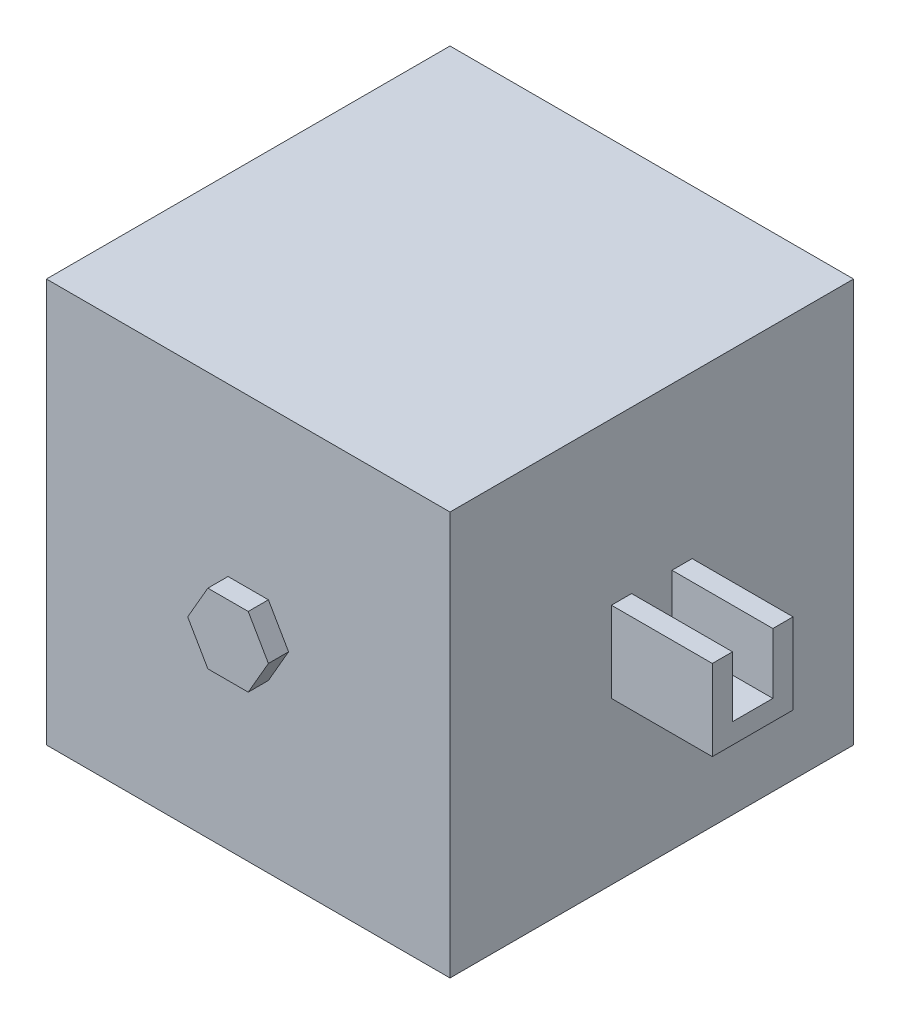
ISO-10303-21;
HEADER;
FILE_DESCRIPTION(('STEP AP214'),'2;1');
FILE_NAME('part.step','',(''),(''),'','','');
FILE_SCHEMA(('AUTOMOTIVE_DESIGN { 1 0 10303 214 1 1 1 1 }'));
ENDSEC;
DATA;
#1=APPLICATION_CONTEXT('core data for automotive mechanical design processes');
#2=APPLICATION_PROTOCOL_DEFINITION('international standard','automotive_design',2000,#1);
#3=PRODUCT_CONTEXT('',#1,'mechanical');
#4=PRODUCT('Part','Part','',(#3));
#5=PRODUCT_RELATED_PRODUCT_CATEGORY('part','',(#4));
#6=PRODUCT_DEFINITION_FORMATION('','',#4);
#7=PRODUCT_DEFINITION_CONTEXT('part definition',#1,'design');
#8=PRODUCT_DEFINITION('design','',#6,#7);
#9=PRODUCT_DEFINITION_SHAPE('','',#8);
#10=(LENGTH_UNIT() NAMED_UNIT(*) SI_UNIT(.MILLI.,.METRE.));
#11=(NAMED_UNIT(*) PLANE_ANGLE_UNIT() SI_UNIT($,.RADIAN.));
#12=(NAMED_UNIT(*) SI_UNIT($,.STERADIAN.) SOLID_ANGLE_UNIT());
#13=UNCERTAINTY_MEASURE_WITH_UNIT(LENGTH_MEASURE(1.E-05),#10,'distance_accuracy_value','');
#14=(GEOMETRIC_REPRESENTATION_CONTEXT(3) GLOBAL_UNCERTAINTY_ASSIGNED_CONTEXT((#13)) GLOBAL_UNIT_ASSIGNED_CONTEXT((#10,
#11,#12)) REPRESENTATION_CONTEXT('',''));
#15=CARTESIAN_POINT('',(0.,0.,0.));
#16=DIRECTION('',(0.,0.,1.));
#17=DIRECTION('',(1.,0.,0.));
#18=AXIS2_PLACEMENT_3D('',#15,#16,#17);
#19=CARTESIAN_POINT('',(0.,0.,0.));
#20=DIRECTION('',(0.,0.,-1.));
#21=DIRECTION('',(-1.,0.,0.));
#22=AXIS2_PLACEMENT_3D('',#19,#20,#21);
#23=PLANE('',#22);
#24=DIRECTION('',(0.,1.,0.));
#25=VECTOR('',#24,1.);
#26=CARTESIAN_POINT('',(25.,-25.,0.));
#27=LINE('',#26,#25);
#28=CARTESIAN_POINT('',(25.,-25.,0.));
#29=VERTEX_POINT('',#28);
#30=CARTESIAN_POINT('',(25.,25.,0.));
#31=VERTEX_POINT('',#30);
#32=EDGE_CURVE('E446',#29,#31,#27,.T.);
#33=ORIENTED_EDGE('',*,*,#32,.F.);
#34=DIRECTION('',(1.,0.,0.));
#35=VECTOR('',#34,1.);
#36=CARTESIAN_POINT('',(-25.,-25.,0.));
#37=LINE('',#36,#35);
#38=CARTESIAN_POINT('',(-25.,-25.,0.));
#39=VERTEX_POINT('',#38);
#40=EDGE_CURVE('E451',#39,#29,#37,.T.);
#41=ORIENTED_EDGE('',*,*,#40,.F.);
#42=DIRECTION('',(0.,-1.,0.));
#43=VECTOR('',#42,1.);
#44=CARTESIAN_POINT('',(-25.,-25.,0.));
#45=LINE('',#44,#43);
#46=CARTESIAN_POINT('',(-25.,25.,0.));
#47=VERTEX_POINT('',#46);
#48=EDGE_CURVE('E462',#47,#39,#45,.T.);
#49=ORIENTED_EDGE('',*,*,#48,.F.);
#50=DIRECTION('',(-1.,0.,0.));
#51=VECTOR('',#50,1.);
#52=CARTESIAN_POINT('',(-25.,25.,0.));
#53=LINE('',#52,#51);
#54=EDGE_CURVE('E460',#31,#47,#53,.T.);
#55=ORIENTED_EDGE('',*,*,#54,.F.);
#56=EDGE_LOOP('',(#33,#41,#49,#55));
#57=FACE_BOUND('',#56,.T.);
#58=DIRECTION('',(0.5,0.866025403784439,0.));
#59=VECTOR('',#58,1.);
#60=CARTESIAN_POINT('',(-5.,0.,0.));
#61=LINE('',#60,#59);
#62=CARTESIAN_POINT('',(-5.,0.,0.));
#63=VERTEX_POINT('',#62);
#64=CARTESIAN_POINT('',(-2.5,4.3301270189222,0.));
#65=VERTEX_POINT('',#64);
#66=EDGE_CURVE('E965',#63,#65,#61,.T.);
#67=ORIENTED_EDGE('',*,*,#66,.F.);
#68=DIRECTION('',(-0.5,0.866025403784439,0.));
#69=VECTOR('',#68,1.);
#70=CARTESIAN_POINT('',(-2.5,-4.3301270189222,0.));
#71=LINE('',#70,#69);
#72=CARTESIAN_POINT('',(-2.5,-4.3301270189222,0.));
#73=VERTEX_POINT('',#72);
#74=EDGE_CURVE('E270',#73,#63,#71,.T.);
#75=ORIENTED_EDGE('',*,*,#74,.F.);
#76=DIRECTION('',(-1.,0.,0.));
#77=VECTOR('',#76,1.);
#78=CARTESIAN_POINT('',(2.5,-4.3301270189222,0.));
#79=LINE('',#78,#77);
#80=CARTESIAN_POINT('',(2.5,-4.3301270189222,0.));
#81=VERTEX_POINT('',#80);
#82=EDGE_CURVE('E266',#81,#73,#79,.T.);
#83=ORIENTED_EDGE('',*,*,#82,.F.);
#84=DIRECTION('',(-0.5,-0.866025403784439,0.));
#85=VECTOR('',#84,1.);
#86=CARTESIAN_POINT('',(5.,0.,0.));
#87=LINE('',#86,#85);
#88=CARTESIAN_POINT('',(5.,0.,0.));
#89=VERTEX_POINT('',#88);
#90=EDGE_CURVE('E961',#89,#81,#87,.T.);
#91=ORIENTED_EDGE('',*,*,#90,.F.);
#92=DIRECTION('',(0.5,-0.866025403784439,0.));
#93=VECTOR('',#92,1.);
#94=CARTESIAN_POINT('',(2.5,4.3301270189222,0.));
#95=LINE('',#94,#93);
#96=CARTESIAN_POINT('',(2.5,4.3301270189222,0.));
#97=VERTEX_POINT('',#96);
#98=EDGE_CURVE('E973',#97,#89,#95,.T.);
#99=ORIENTED_EDGE('',*,*,#98,.F.);
#100=DIRECTION('',(1.,0.,0.));
#101=VECTOR('',#100,1.);
#102=CARTESIAN_POINT('',(-2.5,4.3301270189222,0.));
#103=LINE('',#102,#101);
#104=EDGE_CURVE('E967',#65,#97,#103,.T.);
#105=ORIENTED_EDGE('',*,*,#104,.F.);
#106=EDGE_LOOP('',(#67,#75,#83,#91,#99,#105));
#107=FACE_BOUND('',#106,.T.);
#108=ADVANCED_FACE('F38',(#57,#107),#23,.T.);
#109=CARTESIAN_POINT('',(0.,0.,50.));
#110=DIRECTION('',(0.,0.,-1.));
#111=DIRECTION('',(-1.,0.,0.));
#112=AXIS2_PLACEMENT_3D('',#109,#110,#111);
#113=PLANE('',#112);
#114=DIRECTION('',(0.,1.,0.));
#115=VECTOR('',#114,1.);
#116=CARTESIAN_POINT('',(25.,-25.,50.));
#117=LINE('',#116,#115);
#118=CARTESIAN_POINT('',(25.,-25.,50.));
#119=VERTEX_POINT('',#118);
#120=CARTESIAN_POINT('',(25.,25.,50.));
#121=VERTEX_POINT('',#120);
#122=EDGE_CURVE('E447',#119,#121,#117,.T.);
#123=ORIENTED_EDGE('',*,*,#122,.T.);
#124=DIRECTION('',(-1.,0.,0.));
#125=VECTOR('',#124,1.);
#126=CARTESIAN_POINT('',(-25.,25.,50.));
#127=LINE('',#126,#125);
#128=CARTESIAN_POINT('',(-25.,25.,50.));
#129=VERTEX_POINT('',#128);
#130=EDGE_CURVE('E450',#121,#129,#127,.T.);
#131=ORIENTED_EDGE('',*,*,#130,.T.);
#132=DIRECTION('',(0.,-1.,0.));
#133=VECTOR('',#132,1.);
#134=CARTESIAN_POINT('',(-25.,-25.,50.));
#135=LINE('',#134,#133);
#136=CARTESIAN_POINT('',(-25.,-25.,50.));
#137=VERTEX_POINT('',#136);
#138=EDGE_CURVE('E453',#129,#137,#135,.T.);
#139=ORIENTED_EDGE('',*,*,#138,.T.);
#140=DIRECTION('',(1.,0.,0.));
#141=VECTOR('',#140,1.);
#142=CARTESIAN_POINT('',(-25.,-25.,50.));
#143=LINE('',#142,#141);
#144=EDGE_CURVE('E455',#137,#119,#143,.T.);
#145=ORIENTED_EDGE('',*,*,#144,.T.);
#146=EDGE_LOOP('',(#123,#131,#139,#145));
#147=FACE_BOUND('',#146,.T.);
#148=DIRECTION('',(0.499999999999999,0.866025403784439,0.));
#149=VECTOR('',#148,1.);
#150=CARTESIAN_POINT('',(2.5,-4.3301270189222,50.));
#151=LINE('',#150,#149);
#152=CARTESIAN_POINT('',(2.5,-4.3301270189222,50.));
#153=VERTEX_POINT('',#152);
#154=CARTESIAN_POINT('',(5.,0.,50.));
#155=VERTEX_POINT('',#154);
#156=EDGE_CURVE('E272',#153,#155,#151,.T.);
#157=ORIENTED_EDGE('',*,*,#156,.F.);
#158=DIRECTION('',(1.,0.,0.));
#159=VECTOR('',#158,1.);
#160=CARTESIAN_POINT('',(-2.5,-4.3301270189222,50.));
#161=LINE('',#160,#159);
#162=CARTESIAN_POINT('',(-2.5,-4.3301270189222,50.));
#163=VERTEX_POINT('',#162);
#164=EDGE_CURVE('E284',#163,#153,#161,.T.);
#165=ORIENTED_EDGE('',*,*,#164,.F.);
#166=DIRECTION('',(0.5,-0.866025403784438,0.));
#167=VECTOR('',#166,1.);
#168=CARTESIAN_POINT('',(-5.,0.,50.));
#169=LINE('',#168,#167);
#170=CARTESIAN_POINT('',(-5.,0.,50.));
#171=VERTEX_POINT('',#170);
#172=EDGE_CURVE('E302',#171,#163,#169,.T.);
#173=ORIENTED_EDGE('',*,*,#172,.F.);
#174=DIRECTION('',(-0.5,-0.866025403784439,0.));
#175=VECTOR('',#174,1.);
#176=CARTESIAN_POINT('',(-2.5,4.3301270189222,50.));
#177=LINE('',#176,#175);
#178=CARTESIAN_POINT('',(-2.5,4.3301270189222,50.));
#179=VERTEX_POINT('',#178);
#180=EDGE_CURVE('E299',#179,#171,#177,.T.);
#181=ORIENTED_EDGE('',*,*,#180,.F.);
#182=DIRECTION('',(-1.,0.,0.));
#183=VECTOR('',#182,1.);
#184=CARTESIAN_POINT('',(2.5,4.3301270189222,50.));
#185=LINE('',#184,#183);
#186=CARTESIAN_POINT('',(2.5,4.3301270189222,50.));
#187=VERTEX_POINT('',#186);
#188=EDGE_CURVE('E296',#187,#179,#185,.T.);
#189=ORIENTED_EDGE('',*,*,#188,.F.);
#190=DIRECTION('',(-0.5,0.866025403784439,0.));
#191=VECTOR('',#190,1.);
#192=CARTESIAN_POINT('',(5.,0.,50.));
#193=LINE('',#192,#191);
#194=EDGE_CURVE('E61',#155,#187,#193,.T.);
#195=ORIENTED_EDGE('',*,*,#194,.F.);
#196=EDGE_LOOP('',(#157,#165,#173,#181,#189,#195));
#197=FACE_BOUND('',#196,.T.);
#198=ADVANCED_FACE('F490',(#147,#197),#113,.F.);
#199=CARTESIAN_POINT('',(37.5,5.,20.));
#200=DIRECTION('',(0.,-1.,0.));
#201=DIRECTION('',(0.,0.,-1.));
#202=AXIS2_PLACEMENT_3D('',#199,#200,#201);
#203=PLANE('',#202);
#204=DIRECTION('',(0.,0.,1.));
#205=VECTOR('',#204,1.);
#206=CARTESIAN_POINT('',(25.,5.,20.));
#207=LINE('',#206,#205);
#208=CARTESIAN_POINT('',(25.,5.,20.));
#209=VERTEX_POINT('',#208);
#210=CARTESIAN_POINT('',(25.,5.,22.5));
#211=VERTEX_POINT('',#210);
#212=EDGE_CURVE('E354',#209,#211,#207,.T.);
#213=ORIENTED_EDGE('',*,*,#212,.T.);
#214=DIRECTION('',(1.,0.,0.));
#215=VECTOR('',#214,1.);
#216=CARTESIAN_POINT('',(25.,5.,22.5));
#217=LINE('',#216,#215);
#218=CARTESIAN_POINT('',(37.5,5.,22.5));
#219=VERTEX_POINT('',#218);
#220=EDGE_CURVE('E334',#211,#219,#217,.T.);
#221=ORIENTED_EDGE('',*,*,#220,.T.);
#222=DIRECTION('',(0.,0.,1.));
#223=VECTOR('',#222,1.);
#224=CARTESIAN_POINT('',(37.5,5.,20.));
#225=LINE('',#224,#223);
#226=CARTESIAN_POINT('',(37.5,5.,20.));
#227=VERTEX_POINT('',#226);
#228=EDGE_CURVE('E359',#227,#219,#225,.T.);
#229=ORIENTED_EDGE('',*,*,#228,.F.);
#230=DIRECTION('',(-1.,0.,0.));
#231=VECTOR('',#230,1.);
#232=CARTESIAN_POINT('',(37.5,5.,20.));
#233=LINE('',#232,#231);
#234=EDGE_CURVE('E376',#227,#209,#233,.T.);
#235=ORIENTED_EDGE('',*,*,#234,.T.);
#236=EDGE_LOOP('',(#213,#221,#229,#235));
#237=FACE_BOUND('',#236,.T.);
#238=ADVANCED_FACE('F508',(#237),#203,.F.);
#239=CARTESIAN_POINT('',(25.,-25.,50.));
#240=DIRECTION('',(-1.,0.,0.));
#241=DIRECTION('',(0.,0.,1.));
#242=AXIS2_PLACEMENT_3D('',#239,#240,#241);
#243=PLANE('',#242);
#244=ORIENTED_EDGE('',*,*,#32,.T.);
#245=DIRECTION('',(0.,0.,-1.));
#246=VECTOR('',#245,1.);
#247=CARTESIAN_POINT('',(25.,25.,50.));
#248=LINE('',#247,#246);
#249=EDGE_CURVE('E11',#121,#31,#248,.T.);
#250=ORIENTED_EDGE('',*,*,#249,.F.);
#251=ORIENTED_EDGE('',*,*,#122,.F.);
#252=DIRECTION('',(0.,0.,-1.));
#253=VECTOR('',#252,1.);
#254=CARTESIAN_POINT('',(25.,-25.,50.));
#255=LINE('',#254,#253);
#256=EDGE_CURVE('E457',#119,#29,#255,.T.);
#257=ORIENTED_EDGE('',*,*,#256,.T.);
#258=EDGE_LOOP('',(#244,#250,#251,#257));
#259=FACE_BOUND('',#258,.T.);
#260=DIRECTION('',(0.,-1.,0.));
#261=VECTOR('',#260,1.);
#262=CARTESIAN_POINT('',(25.,-5.,30.));
#263=LINE('',#262,#261);
#264=CARTESIAN_POINT('',(25.,5.,30.));
#265=VERTEX_POINT('',#264);
#266=CARTESIAN_POINT('',(25.,-5.,30.));
#267=VERTEX_POINT('',#266);
#268=EDGE_CURVE('E343',#265,#267,#263,.T.);
#269=ORIENTED_EDGE('',*,*,#268,.F.);
#270=CARTESIAN_POINT('',(25.,5.,27.5));
#271=VERTEX_POINT('',#270);
#272=EDGE_CURVE('E371',#271,#265,#207,.T.);
#273=ORIENTED_EDGE('',*,*,#272,.F.);
#274=DIRECTION('',(0.,-1.,0.));
#275=VECTOR('',#274,1.);
#276=CARTESIAN_POINT('',(25.,-2.5,27.5));
#277=LINE('',#276,#275);
#278=CARTESIAN_POINT('',(25.,-2.5,27.5));
#279=VERTEX_POINT('',#278);
#280=EDGE_CURVE('E327',#271,#279,#277,.T.);
#281=ORIENTED_EDGE('',*,*,#280,.T.);
#282=DIRECTION('',(0.,0.,-1.));
#283=VECTOR('',#282,1.);
#284=CARTESIAN_POINT('',(25.,-2.5,27.5));
#285=LINE('',#284,#283);
#286=CARTESIAN_POINT('',(25.,-2.5,22.5));
#287=VERTEX_POINT('',#286);
#288=EDGE_CURVE('E331',#279,#287,#285,.T.);
#289=ORIENTED_EDGE('',*,*,#288,.T.);
#290=DIRECTION('',(0.,1.,0.));
#291=VECTOR('',#290,1.);
#292=CARTESIAN_POINT('',(25.,-2.5,22.5));
#293=LINE('',#292,#291);
#294=EDGE_CURVE('E324',#287,#211,#293,.T.);
#295=ORIENTED_EDGE('',*,*,#294,.T.);
#296=ORIENTED_EDGE('',*,*,#212,.F.);
#297=DIRECTION('',(0.,1.,0.));
#298=VECTOR('',#297,1.);
#299=CARTESIAN_POINT('',(25.,-5.,20.));
#300=LINE('',#299,#298);
#301=CARTESIAN_POINT('',(25.,-5.,20.));
#302=VERTEX_POINT('',#301);
#303=EDGE_CURVE('E368',#302,#209,#300,.T.);
#304=ORIENTED_EDGE('',*,*,#303,.F.);
#305=DIRECTION('',(0.,0.,-1.));
#306=VECTOR('',#305,1.);
#307=CARTESIAN_POINT('',(25.,-5.,20.));
#308=LINE('',#307,#306);
#309=EDGE_CURVE('E365',#267,#302,#308,.T.);
#310=ORIENTED_EDGE('',*,*,#309,.F.);
#311=EDGE_LOOP('',(#269,#273,#281,#289,#295,#296,#304,#310));
#312=FACE_BOUND('',#311,.T.);
#313=ADVANCED_FACE('F40',(#259,#312),#243,.F.);
#314=CARTESIAN_POINT('',(-37.5,5.,0.));
#315=DIRECTION('',(0.,1.,0.));
#316=DIRECTION('',(0.,0.,1.));
#317=AXIS2_PLACEMENT_3D('',#314,#315,#316);
#318=PLANE('',#317);
#319=DIRECTION('',(-1.,0.,0.));
#320=VECTOR('',#319,1.);
#321=CARTESIAN_POINT('',(-25.,5.,27.5));
#322=LINE('',#321,#320);
#323=CARTESIAN_POINT('',(-25.,5.,27.5));
#324=VERTEX_POINT('',#323);
#325=CARTESIAN_POINT('',(-37.5,5.,27.5));
#326=VERTEX_POINT('',#325);
#327=EDGE_CURVE('E396',#324,#326,#322,.T.);
#328=ORIENTED_EDGE('',*,*,#327,.T.);
#329=DIRECTION('',(0.,0.,1.));
#330=VECTOR('',#329,1.);
#331=CARTESIAN_POINT('',(-37.5,5.,0.));
#332=LINE('',#331,#330);
#333=CARTESIAN_POINT('',(-37.5,5.,30.));
#334=VERTEX_POINT('',#333);
#335=EDGE_CURVE('E416',#326,#334,#332,.T.);
#336=ORIENTED_EDGE('',*,*,#335,.T.);
#337=DIRECTION('',(1.,0.,0.));
#338=VECTOR('',#337,1.);
#339=CARTESIAN_POINT('',(-37.5,5.,30.));
#340=LINE('',#339,#338);
#341=CARTESIAN_POINT('',(-25.,5.,30.));
#342=VERTEX_POINT('',#341);
#343=EDGE_CURVE('E423',#334,#342,#340,.T.);
#344=ORIENTED_EDGE('',*,*,#343,.T.);
#345=DIRECTION('',(0.,0.,1.));
#346=VECTOR('',#345,1.);
#347=CARTESIAN_POINT('',(-25.,5.,0.));
#348=LINE('',#347,#346);
#349=EDGE_CURVE('E405',#324,#342,#348,.T.);
#350=ORIENTED_EDGE('',*,*,#349,.F.);
#351=EDGE_LOOP('',(#328,#336,#344,#350));
#352=FACE_BOUND('',#351,.T.);
#353=ADVANCED_FACE('F493',(#352),#318,.T.);
#354=CARTESIAN_POINT('',(-25.,25.,50.));
#355=DIRECTION('',(0.,-1.,0.));
#356=DIRECTION('',(0.,0.,-1.));
#357=AXIS2_PLACEMENT_3D('',#354,#355,#356);
#358=PLANE('',#357);
#359=ORIENTED_EDGE('',*,*,#54,.T.);
#360=DIRECTION('',(0.,0.,-1.));
#361=VECTOR('',#360,1.);
#362=CARTESIAN_POINT('',(-25.,25.,50.));
#363=LINE('',#362,#361);
#364=EDGE_CURVE('E46',#129,#47,#363,.T.);
#365=ORIENTED_EDGE('',*,*,#364,.F.);
#366=ORIENTED_EDGE('',*,*,#130,.F.);
#367=ORIENTED_EDGE('',*,*,#249,.T.);
#368=EDGE_LOOP('',(#359,#365,#366,#367));
#369=FACE_BOUND('',#368,.T.);
#370=ADVANCED_FACE('F491',(#369),#358,.F.);
#371=CARTESIAN_POINT('',(-25.,-25.,50.));
#372=DIRECTION('',(1.,0.,0.));
#373=DIRECTION('',(0.,0.,-1.));
#374=AXIS2_PLACEMENT_3D('',#371,#372,#373);
#375=PLANE('',#374);
#376=DIRECTION('',(0.,-1.,0.));
#377=VECTOR('',#376,1.);
#378=CARTESIAN_POINT('',(-25.,0.,20.));
#379=LINE('',#378,#377);
#380=CARTESIAN_POINT('',(-25.,5.,20.));
#381=VERTEX_POINT('',#380);
#382=CARTESIAN_POINT('',(-25.,-5.,20.));
#383=VERTEX_POINT('',#382);
#384=EDGE_CURVE('E427',#381,#383,#379,.T.);
#385=ORIENTED_EDGE('',*,*,#384,.F.);
#386=CARTESIAN_POINT('',(-25.,5.,22.5));
#387=VERTEX_POINT('',#386);
#388=EDGE_CURVE('E424',#381,#387,#348,.T.);
#389=ORIENTED_EDGE('',*,*,#388,.T.);
#390=DIRECTION('',(0.,-1.,0.));
#391=VECTOR('',#390,1.);
#392=CARTESIAN_POINT('',(-25.,5.,22.5));
#393=LINE('',#392,#391);
#394=CARTESIAN_POINT('',(-25.,-2.5,22.5));
#395=VERTEX_POINT('',#394);
#396=EDGE_CURVE('E389',#387,#395,#393,.T.);
#397=ORIENTED_EDGE('',*,*,#396,.T.);
#398=DIRECTION('',(0.,0.,1.));
#399=VECTOR('',#398,1.);
#400=CARTESIAN_POINT('',(-25.,-2.5,22.5));
#401=LINE('',#400,#399);
#402=CARTESIAN_POINT('',(-25.,-2.5,27.5));
#403=VERTEX_POINT('',#402);
#404=EDGE_CURVE('E393',#395,#403,#401,.T.);
#405=ORIENTED_EDGE('',*,*,#404,.T.);
#406=DIRECTION('',(0.,1.,0.));
#407=VECTOR('',#406,1.);
#408=CARTESIAN_POINT('',(-25.,-2.5,27.5));
#409=LINE('',#408,#407);
#410=EDGE_CURVE('E386',#403,#324,#409,.T.);
#411=ORIENTED_EDGE('',*,*,#410,.T.);
#412=ORIENTED_EDGE('',*,*,#349,.T.);
#413=DIRECTION('',(0.,-1.,0.));
#414=VECTOR('',#413,1.);
#415=CARTESIAN_POINT('',(-25.,0.,30.));
#416=LINE('',#415,#414);
#417=CARTESIAN_POINT('',(-25.,-5.,30.));
#418=VERTEX_POINT('',#417);
#419=EDGE_CURVE('E433',#342,#418,#416,.T.);
#420=ORIENTED_EDGE('',*,*,#419,.T.);
#421=DIRECTION('',(0.,0.,1.));
#422=VECTOR('',#421,1.);
#423=CARTESIAN_POINT('',(-25.,-5.,0.));
#424=LINE('',#423,#422);
#425=EDGE_CURVE('E430',#383,#418,#424,.T.);
#426=ORIENTED_EDGE('',*,*,#425,.F.);
#427=EDGE_LOOP('',(#385,#389,#397,#405,#411,#412,#420,#426));
#428=FACE_BOUND('',#427,.T.);
#429=ORIENTED_EDGE('',*,*,#48,.T.);
#430=DIRECTION('',(0.,0.,-1.));
#431=VECTOR('',#430,1.);
#432=CARTESIAN_POINT('',(-25.,-25.,50.));
#433=LINE('',#432,#431);
#434=EDGE_CURVE('E467',#137,#39,#433,.T.);
#435=ORIENTED_EDGE('',*,*,#434,.F.);
#436=ORIENTED_EDGE('',*,*,#138,.F.);
#437=ORIENTED_EDGE('',*,*,#364,.T.);
#438=EDGE_LOOP('',(#429,#435,#436,#437));
#439=FACE_BOUND('',#438,.T.);
#440=ADVANCED_FACE('F474',(#428,#439),#375,.F.);
#441=CARTESIAN_POINT('',(-25.,-25.,50.));
#442=DIRECTION('',(0.,1.,0.));
#443=DIRECTION('',(0.,0.,1.));
#444=AXIS2_PLACEMENT_3D('',#441,#442,#443);
#445=PLANE('',#444);
#446=ORIENTED_EDGE('',*,*,#40,.T.);
#447=ORIENTED_EDGE('',*,*,#256,.F.);
#448=ORIENTED_EDGE('',*,*,#144,.F.);
#449=ORIENTED_EDGE('',*,*,#434,.T.);
#450=EDGE_LOOP('',(#446,#447,#448,#449));
#451=FACE_BOUND('',#450,.T.);
#452=ADVANCED_FACE('F483',(#451),#445,.F.);
#453=DIRECTION('',(-1.,0.,0.));
#454=VECTOR('',#453,1.);
#455=CARTESIAN_POINT('',(-25.,5.,22.5));
#456=LINE('',#455,#454);
#457=CARTESIAN_POINT('',(-37.5,5.,22.5));
#458=VERTEX_POINT('',#457);
#459=EDGE_CURVE('E408',#387,#458,#456,.T.);
#460=ORIENTED_EDGE('',*,*,#459,.F.);
#461=ORIENTED_EDGE('',*,*,#388,.F.);
#462=DIRECTION('',(1.,0.,0.));
#463=VECTOR('',#462,1.);
#464=CARTESIAN_POINT('',(-37.5,5.,20.));
#465=LINE('',#464,#463);
#466=CARTESIAN_POINT('',(-37.5,5.,20.));
#467=VERTEX_POINT('',#466);
#468=EDGE_CURVE('E443',#467,#381,#465,.T.);
#469=ORIENTED_EDGE('',*,*,#468,.F.);
#470=EDGE_CURVE('E412',#467,#458,#332,.T.);
#471=ORIENTED_EDGE('',*,*,#470,.T.);
#472=EDGE_LOOP('',(#460,#461,#469,#471));
#473=FACE_BOUND('',#472,.T.);
#474=ADVANCED_FACE('F502',(#473),#318,.T.);
#475=CARTESIAN_POINT('',(-37.5,0.,20.));
#476=DIRECTION('',(0.,0.,1.));
#477=DIRECTION('',(0.,-1.,0.));
#478=AXIS2_PLACEMENT_3D('',#475,#476,#477);
#479=PLANE('',#478);
#480=ORIENTED_EDGE('',*,*,#384,.T.);
#481=DIRECTION('',(1.,0.,0.));
#482=VECTOR('',#481,1.);
#483=CARTESIAN_POINT('',(-37.5,-5.,20.));
#484=LINE('',#483,#482);
#485=CARTESIAN_POINT('',(-37.5,-5.,20.));
#486=VERTEX_POINT('',#485);
#487=EDGE_CURVE('E440',#486,#383,#484,.T.);
#488=ORIENTED_EDGE('',*,*,#487,.F.);
#489=DIRECTION('',(0.,-1.,0.));
#490=VECTOR('',#489,1.);
#491=CARTESIAN_POINT('',(-37.5,0.,20.));
#492=LINE('',#491,#490);
#493=EDGE_CURVE('E415',#467,#486,#492,.T.);
#494=ORIENTED_EDGE('',*,*,#493,.F.);
#495=ORIENTED_EDGE('',*,*,#468,.T.);
#496=EDGE_LOOP('',(#480,#488,#494,#495));
#497=FACE_BOUND('',#496,.T.);
#498=ADVANCED_FACE('F515',(#497),#479,.F.);
#499=CARTESIAN_POINT('',(-37.5,-5.,0.));
#500=DIRECTION('',(0.,1.,0.));
#501=DIRECTION('',(0.,0.,1.));
#502=AXIS2_PLACEMENT_3D('',#499,#500,#501);
#503=PLANE('',#502);
#504=ORIENTED_EDGE('',*,*,#425,.T.);
#505=DIRECTION('',(1.,0.,0.));
#506=VECTOR('',#505,1.);
#507=CARTESIAN_POINT('',(-37.5,-5.,30.));
#508=LINE('',#507,#506);
#509=CARTESIAN_POINT('',(-37.5,-5.,30.));
#510=VERTEX_POINT('',#509);
#511=EDGE_CURVE('E437',#510,#418,#508,.T.);
#512=ORIENTED_EDGE('',*,*,#511,.F.);
#513=DIRECTION('',(0.,0.,1.));
#514=VECTOR('',#513,1.);
#515=CARTESIAN_POINT('',(-37.5,-5.,0.));
#516=LINE('',#515,#514);
#517=EDGE_CURVE('E418',#486,#510,#516,.T.);
#518=ORIENTED_EDGE('',*,*,#517,.F.);
#519=ORIENTED_EDGE('',*,*,#487,.T.);
#520=EDGE_LOOP('',(#504,#512,#518,#519));
#521=FACE_BOUND('',#520,.T.);
#522=ADVANCED_FACE('F520',(#521),#503,.F.);
#523=CARTESIAN_POINT('',(-37.5,0.,30.));
#524=DIRECTION('',(0.,0.,1.));
#525=DIRECTION('',(1.,0.,0.));
#526=AXIS2_PLACEMENT_3D('',#523,#524,#525);
#527=PLANE('',#526);
#528=ORIENTED_EDGE('',*,*,#419,.F.);
#529=ORIENTED_EDGE('',*,*,#343,.F.);
#530=DIRECTION('',(0.,-1.,0.));
#531=VECTOR('',#530,1.);
#532=CARTESIAN_POINT('',(-37.5,0.,30.));
#533=LINE('',#532,#531);
#534=EDGE_CURVE('E420',#334,#510,#533,.T.);
#535=ORIENTED_EDGE('',*,*,#534,.T.);
#536=ORIENTED_EDGE('',*,*,#511,.T.);
#537=EDGE_LOOP('',(#528,#529,#535,#536));
#538=FACE_BOUND('',#537,.T.);
#539=ADVANCED_FACE('F527',(#538),#527,.T.);
#540=CARTESIAN_POINT('',(-37.5,0.,0.));
#541=DIRECTION('',(-1.,0.,0.));
#542=DIRECTION('',(0.,0.,1.));
#543=AXIS2_PLACEMENT_3D('',#540,#541,#542);
#544=PLANE('',#543);
#545=DIRECTION('',(0.,1.,0.));
#546=VECTOR('',#545,1.);
#547=CARTESIAN_POINT('',(-37.5,-2.5,27.5));
#548=LINE('',#547,#546);
#549=CARTESIAN_POINT('',(-37.5,-2.5,27.5));
#550=VERTEX_POINT('',#549);
#551=EDGE_CURVE('E385',#550,#326,#548,.T.);
#552=ORIENTED_EDGE('',*,*,#551,.F.);
#553=DIRECTION('',(0.,0.,1.));
#554=VECTOR('',#553,1.);
#555=CARTESIAN_POINT('',(-37.5,-2.5,22.5));
#556=LINE('',#555,#554);
#557=CARTESIAN_POINT('',(-37.5,-2.5,22.5));
#558=VERTEX_POINT('',#557);
#559=EDGE_CURVE('E390',#558,#550,#556,.T.);
#560=ORIENTED_EDGE('',*,*,#559,.F.);
#561=DIRECTION('',(0.,-1.,0.));
#562=VECTOR('',#561,1.);
#563=CARTESIAN_POINT('',(-37.5,5.,22.5));
#564=LINE('',#563,#562);
#565=EDGE_CURVE('E398',#458,#558,#564,.T.);
#566=ORIENTED_EDGE('',*,*,#565,.F.);
#567=ORIENTED_EDGE('',*,*,#470,.F.);
#568=ORIENTED_EDGE('',*,*,#493,.T.);
#569=ORIENTED_EDGE('',*,*,#517,.T.);
#570=ORIENTED_EDGE('',*,*,#534,.F.);
#571=ORIENTED_EDGE('',*,*,#335,.F.);
#572=EDGE_LOOP('',(#552,#560,#566,#567,#568,#569,#570,#571));
#573=FACE_BOUND('',#572,.T.);
#574=ADVANCED_FACE('F531',(#573),#544,.T.);
#575=CARTESIAN_POINT('',(-25.,-2.5,27.5));
#576=DIRECTION('',(0.,0.,1.));
#577=DIRECTION('',(0.,-1.,0.));
#578=AXIS2_PLACEMENT_3D('',#575,#576,#577);
#579=PLANE('',#578);
#580=ORIENTED_EDGE('',*,*,#551,.T.);
#581=ORIENTED_EDGE('',*,*,#327,.F.);
#582=ORIENTED_EDGE('',*,*,#410,.F.);
#583=DIRECTION('',(-1.,0.,0.));
#584=VECTOR('',#583,1.);
#585=CARTESIAN_POINT('',(-25.,-2.5,27.5));
#586=LINE('',#585,#584);
#587=EDGE_CURVE('E403',#403,#550,#586,.T.);
#588=ORIENTED_EDGE('',*,*,#587,.T.);
#589=EDGE_LOOP('',(#580,#581,#582,#588));
#590=FACE_BOUND('',#589,.T.);
#591=ADVANCED_FACE('F535',(#590),#579,.F.);
#592=CARTESIAN_POINT('',(-25.,-2.5,22.5));
#593=DIRECTION('',(0.,-1.,0.));
#594=DIRECTION('',(0.,0.,-1.));
#595=AXIS2_PLACEMENT_3D('',#592,#593,#594);
#596=PLANE('',#595);
#597=ORIENTED_EDGE('',*,*,#559,.T.);
#598=ORIENTED_EDGE('',*,*,#587,.F.);
#599=ORIENTED_EDGE('',*,*,#404,.F.);
#600=DIRECTION('',(-1.,0.,0.));
#601=VECTOR('',#600,1.);
#602=CARTESIAN_POINT('',(-25.,-2.5,22.5));
#603=LINE('',#602,#601);
#604=EDGE_CURVE('E406',#395,#558,#603,.T.);
#605=ORIENTED_EDGE('',*,*,#604,.T.);
#606=EDGE_LOOP('',(#597,#598,#599,#605));
#607=FACE_BOUND('',#606,.T.);
#608=ADVANCED_FACE('F539',(#607),#596,.F.);
#609=CARTESIAN_POINT('',(-25.,5.,22.5));
#610=DIRECTION('',(0.,0.,-1.));
#611=DIRECTION('',(0.,1.,0.));
#612=AXIS2_PLACEMENT_3D('',#609,#610,#611);
#613=PLANE('',#612);
#614=ORIENTED_EDGE('',*,*,#565,.T.);
#615=ORIENTED_EDGE('',*,*,#604,.F.);
#616=ORIENTED_EDGE('',*,*,#396,.F.);
#617=ORIENTED_EDGE('',*,*,#459,.T.);
#618=EDGE_LOOP('',(#614,#615,#616,#617));
#619=FACE_BOUND('',#618,.T.);
#620=ADVANCED_FACE('F541',(#619),#613,.F.);
#621=CARTESIAN_POINT('',(37.5,-5.,30.));
#622=DIRECTION('',(0.,0.,-1.));
#623=DIRECTION('',(-1.,0.,0.));
#624=AXIS2_PLACEMENT_3D('',#621,#622,#623);
#625=PLANE('',#624);
#626=ORIENTED_EDGE('',*,*,#268,.T.);
#627=DIRECTION('',(-1.,0.,0.));
#628=VECTOR('',#627,1.);
#629=CARTESIAN_POINT('',(37.5,-5.,30.));
#630=LINE('',#629,#628);
#631=CARTESIAN_POINT('',(37.5,-5.,30.));
#632=VERTEX_POINT('',#631);
#633=EDGE_CURVE('E382',#632,#267,#630,.T.);
#634=ORIENTED_EDGE('',*,*,#633,.F.);
#635=DIRECTION('',(0.,-1.,0.));
#636=VECTOR('',#635,1.);
#637=CARTESIAN_POINT('',(37.5,-5.,30.));
#638=LINE('',#637,#636);
#639=CARTESIAN_POINT('',(37.5,5.,30.));
#640=VERTEX_POINT('',#639);
#641=EDGE_CURVE('E350',#640,#632,#638,.T.);
#642=ORIENTED_EDGE('',*,*,#641,.F.);
#643=DIRECTION('',(-1.,0.,0.));
#644=VECTOR('',#643,1.);
#645=CARTESIAN_POINT('',(37.5,5.,30.));
#646=LINE('',#645,#644);
#647=EDGE_CURVE('E362',#640,#265,#646,.T.);
#648=ORIENTED_EDGE('',*,*,#647,.T.);
#649=EDGE_LOOP('',(#626,#634,#642,#648));
#650=FACE_BOUND('',#649,.T.);
#651=ADVANCED_FACE('F544',(#650),#625,.F.);
#652=CARTESIAN_POINT('',(37.5,-5.,20.));
#653=DIRECTION('',(0.,1.,0.));
#654=DIRECTION('',(0.,0.,1.));
#655=AXIS2_PLACEMENT_3D('',#652,#653,#654);
#656=PLANE('',#655);
#657=ORIENTED_EDGE('',*,*,#309,.T.);
#658=DIRECTION('',(-1.,0.,0.));
#659=VECTOR('',#658,1.);
#660=CARTESIAN_POINT('',(37.5,-5.,20.));
#661=LINE('',#660,#659);
#662=CARTESIAN_POINT('',(37.5,-5.,20.));
#663=VERTEX_POINT('',#662);
#664=EDGE_CURVE('E379',#663,#302,#661,.T.);
#665=ORIENTED_EDGE('',*,*,#664,.F.);
#666=DIRECTION('',(0.,0.,-1.));
#667=VECTOR('',#666,1.);
#668=CARTESIAN_POINT('',(37.5,-5.,20.));
#669=LINE('',#668,#667);
#670=EDGE_CURVE('E353',#632,#663,#669,.T.);
#671=ORIENTED_EDGE('',*,*,#670,.F.);
#672=ORIENTED_EDGE('',*,*,#633,.T.);
#673=EDGE_LOOP('',(#657,#665,#671,#672));
#674=FACE_BOUND('',#673,.T.);
#675=ADVANCED_FACE('F551',(#674),#656,.F.);
#676=CARTESIAN_POINT('',(37.5,-5.,20.));
#677=DIRECTION('',(0.,0.,1.));
#678=DIRECTION('',(1.,0.,0.));
#679=AXIS2_PLACEMENT_3D('',#676,#677,#678);
#680=PLANE('',#679);
#681=ORIENTED_EDGE('',*,*,#303,.T.);
#682=ORIENTED_EDGE('',*,*,#234,.F.);
#683=DIRECTION('',(0.,1.,0.));
#684=VECTOR('',#683,1.);
#685=CARTESIAN_POINT('',(37.5,-5.,20.));
#686=LINE('',#685,#684);
#687=EDGE_CURVE('E356',#663,#227,#686,.T.);
#688=ORIENTED_EDGE('',*,*,#687,.F.);
#689=ORIENTED_EDGE('',*,*,#664,.T.);
#690=EDGE_LOOP('',(#681,#682,#688,#689));
#691=FACE_BOUND('',#690,.T.);
#692=ADVANCED_FACE('F555',(#691),#680,.F.);
#693=CARTESIAN_POINT('',(37.5,5.,27.5));
#694=VERTEX_POINT('',#693);
#695=EDGE_CURVE('E358',#694,#640,#225,.T.);
#696=ORIENTED_EDGE('',*,*,#695,.F.);
#697=DIRECTION('',(1.,0.,0.));
#698=VECTOR('',#697,1.);
#699=CARTESIAN_POINT('',(25.,5.,27.5));
#700=LINE('',#699,#698);
#701=EDGE_CURVE('E346',#271,#694,#700,.T.);
#702=ORIENTED_EDGE('',*,*,#701,.F.);
#703=ORIENTED_EDGE('',*,*,#272,.T.);
#704=ORIENTED_EDGE('',*,*,#647,.F.);
#705=EDGE_LOOP('',(#696,#702,#703,#704));
#706=FACE_BOUND('',#705,.T.);
#707=ADVANCED_FACE('F559',(#706),#203,.F.);
#708=CARTESIAN_POINT('',(37.5,0.,0.));
#709=DIRECTION('',(1.,0.,0.));
#710=DIRECTION('',(0.,0.,-1.));
#711=AXIS2_PLACEMENT_3D('',#708,#709,#710);
#712=PLANE('',#711);
#713=DIRECTION('',(0.,1.,0.));
#714=VECTOR('',#713,1.);
#715=CARTESIAN_POINT('',(37.5,-2.5,22.5));
#716=LINE('',#715,#714);
#717=CARTESIAN_POINT('',(37.5,-2.5,22.5));
#718=VERTEX_POINT('',#717);
#719=EDGE_CURVE('E323',#718,#219,#716,.T.);
#720=ORIENTED_EDGE('',*,*,#719,.F.);
#721=DIRECTION('',(0.,0.,-1.));
#722=VECTOR('',#721,1.);
#723=CARTESIAN_POINT('',(37.5,-2.5,27.5));
#724=LINE('',#723,#722);
#725=CARTESIAN_POINT('',(37.5,-2.5,27.5));
#726=VERTEX_POINT('',#725);
#727=EDGE_CURVE('E328',#726,#718,#724,.T.);
#728=ORIENTED_EDGE('',*,*,#727,.F.);
#729=DIRECTION('',(0.,-1.,0.));
#730=VECTOR('',#729,1.);
#731=CARTESIAN_POINT('',(37.5,-2.5,27.5));
#732=LINE('',#731,#730);
#733=EDGE_CURVE('E336',#694,#726,#732,.T.);
#734=ORIENTED_EDGE('',*,*,#733,.F.);
#735=ORIENTED_EDGE('',*,*,#695,.T.);
#736=ORIENTED_EDGE('',*,*,#641,.T.);
#737=ORIENTED_EDGE('',*,*,#670,.T.);
#738=ORIENTED_EDGE('',*,*,#687,.T.);
#739=ORIENTED_EDGE('',*,*,#228,.T.);
#740=EDGE_LOOP('',(#720,#728,#734,#735,#736,#737,#738,#739));
#741=FACE_BOUND('',#740,.T.);
#742=ADVANCED_FACE('F563',(#741),#712,.T.);
#743=CARTESIAN_POINT('',(25.,-2.5,22.5));
#744=DIRECTION('',(0.,0.,-1.));
#745=DIRECTION('',(-1.,0.,0.));
#746=AXIS2_PLACEMENT_3D('',#743,#744,#745);
#747=PLANE('',#746);
#748=ORIENTED_EDGE('',*,*,#719,.T.);
#749=ORIENTED_EDGE('',*,*,#220,.F.);
#750=ORIENTED_EDGE('',*,*,#294,.F.);
#751=DIRECTION('',(1.,0.,0.));
#752=VECTOR('',#751,1.);
#753=CARTESIAN_POINT('',(25.,-2.5,22.5));
#754=LINE('',#753,#752);
#755=EDGE_CURVE('E341',#287,#718,#754,.T.);
#756=ORIENTED_EDGE('',*,*,#755,.T.);
#757=EDGE_LOOP('',(#748,#749,#750,#756));
#758=FACE_BOUND('',#757,.T.);
#759=ADVANCED_FACE('F567',(#758),#747,.F.);
#760=CARTESIAN_POINT('',(25.,-2.5,27.5));
#761=DIRECTION('',(0.,-1.,0.));
#762=DIRECTION('',(0.,0.,-1.));
#763=AXIS2_PLACEMENT_3D('',#760,#761,#762);
#764=PLANE('',#763);
#765=ORIENTED_EDGE('',*,*,#727,.T.);
#766=ORIENTED_EDGE('',*,*,#755,.F.);
#767=ORIENTED_EDGE('',*,*,#288,.F.);
#768=DIRECTION('',(1.,0.,0.));
#769=VECTOR('',#768,1.);
#770=CARTESIAN_POINT('',(25.,-2.5,27.5));
#771=LINE('',#770,#769);
#772=EDGE_CURVE('E344',#279,#726,#771,.T.);
#773=ORIENTED_EDGE('',*,*,#772,.T.);
#774=EDGE_LOOP('',(#765,#766,#767,#773));
#775=FACE_BOUND('',#774,.T.);
#776=ADVANCED_FACE('F571',(#775),#764,.F.);
#777=CARTESIAN_POINT('',(25.,-2.5,27.5));
#778=DIRECTION('',(0.,0.,1.));
#779=DIRECTION('',(1.,0.,0.));
#780=AXIS2_PLACEMENT_3D('',#777,#778,#779);
#781=PLANE('',#780);
#782=ORIENTED_EDGE('',*,*,#733,.T.);
#783=ORIENTED_EDGE('',*,*,#772,.F.);
#784=ORIENTED_EDGE('',*,*,#280,.F.);
#785=ORIENTED_EDGE('',*,*,#701,.T.);
#786=EDGE_LOOP('',(#782,#783,#784,#785));
#787=FACE_BOUND('',#786,.T.);
#788=ADVANCED_FACE('F573',(#787),#781,.F.);
#789=CARTESIAN_POINT('',(2.5,-4.3301270189222,52.5));
#790=DIRECTION('',(-0.866025403784439,0.499999999999999,0.));
#791=DIRECTION('',(-0.499999999999999,-0.866025403784439,0.));
#792=AXIS2_PLACEMENT_3D('',#789,#790,#791);
#793=PLANE('',#792);
#794=ORIENTED_EDGE('',*,*,#156,.T.);
#795=DIRECTION('',(0.,0.,-1.));
#796=VECTOR('',#795,1.);
#797=CARTESIAN_POINT('',(5.,0.,52.5));
#798=LINE('',#797,#796);
#799=CARTESIAN_POINT('',(5.,0.,52.5));
#800=VERTEX_POINT('',#799);
#801=EDGE_CURVE('E321',#800,#155,#798,.T.);
#802=ORIENTED_EDGE('',*,*,#801,.F.);
#803=DIRECTION('',(0.499999999999999,0.866025403784439,0.));
#804=VECTOR('',#803,1.);
#805=CARTESIAN_POINT('',(2.5,-4.3301270189222,52.5));
#806=LINE('',#805,#804);
#807=CARTESIAN_POINT('',(2.5,-4.3301270189222,52.5));
#808=VERTEX_POINT('',#807);
#809=EDGE_CURVE('E280',#808,#800,#806,.T.);
#810=ORIENTED_EDGE('',*,*,#809,.F.);
#811=DIRECTION('',(0.,0.,-1.));
#812=VECTOR('',#811,1.);
#813=CARTESIAN_POINT('',(2.5,-4.3301270189222,52.5));
#814=LINE('',#813,#812);
#815=EDGE_CURVE('E293',#808,#153,#814,.T.);
#816=ORIENTED_EDGE('',*,*,#815,.T.);
#817=EDGE_LOOP('',(#794,#802,#810,#816));
#818=FACE_BOUND('',#817,.T.);
#819=ADVANCED_FACE('F576',(#818),#793,.F.);
#820=CARTESIAN_POINT('',(5.,0.,52.5));
#821=DIRECTION('',(-0.866025403784439,-0.5,0.));
#822=DIRECTION('',(0.5,-0.866025403784439,0.));
#823=AXIS2_PLACEMENT_3D('',#820,#821,#822);
#824=PLANE('',#823);
#825=ORIENTED_EDGE('',*,*,#194,.T.);
#826=DIRECTION('',(0.,0.,-1.));
#827=VECTOR('',#826,1.);
#828=CARTESIAN_POINT('',(2.5,4.3301270189222,52.5));
#829=LINE('',#828,#827);
#830=CARTESIAN_POINT('',(2.5,4.3301270189222,52.5));
#831=VERTEX_POINT('',#830);
#832=EDGE_CURVE('E318',#831,#187,#829,.T.);
#833=ORIENTED_EDGE('',*,*,#832,.F.);
#834=DIRECTION('',(-0.5,0.866025403784439,0.));
#835=VECTOR('',#834,1.);
#836=CARTESIAN_POINT('',(5.,0.,52.5));
#837=LINE('',#836,#835);
#838=EDGE_CURVE('E283',#800,#831,#837,.T.);
#839=ORIENTED_EDGE('',*,*,#838,.F.);
#840=ORIENTED_EDGE('',*,*,#801,.T.);
#841=EDGE_LOOP('',(#825,#833,#839,#840));
#842=FACE_BOUND('',#841,.T.);
#843=ADVANCED_FACE('F583',(#842),#824,.F.);
#844=CARTESIAN_POINT('',(2.5,4.3301270189222,52.5));
#845=DIRECTION('',(0.,-1.,0.));
#846=DIRECTION('',(0.,0.,-1.));
#847=AXIS2_PLACEMENT_3D('',#844,#845,#846);
#848=PLANE('',#847);
#849=ORIENTED_EDGE('',*,*,#188,.T.);
#850=DIRECTION('',(0.,0.,-1.));
#851=VECTOR('',#850,1.);
#852=CARTESIAN_POINT('',(-2.5,4.3301270189222,52.5));
#853=LINE('',#852,#851);
#854=CARTESIAN_POINT('',(-2.5,4.3301270189222,52.5));
#855=VERTEX_POINT('',#854);
#856=EDGE_CURVE('E315',#855,#179,#853,.T.);
#857=ORIENTED_EDGE('',*,*,#856,.F.);
#858=DIRECTION('',(-1.,0.,0.));
#859=VECTOR('',#858,1.);
#860=CARTESIAN_POINT('',(2.5,4.3301270189222,52.5));
#861=LINE('',#860,#859);
#862=EDGE_CURVE('E286',#831,#855,#861,.T.);
#863=ORIENTED_EDGE('',*,*,#862,.F.);
#864=ORIENTED_EDGE('',*,*,#832,.T.);
#865=EDGE_LOOP('',(#849,#857,#863,#864));
#866=FACE_BOUND('',#865,.T.);
#867=ADVANCED_FACE('F587',(#866),#848,.F.);
#868=CARTESIAN_POINT('',(-2.5,4.3301270189222,52.5));
#869=DIRECTION('',(0.866025403784439,-0.5,0.));
#870=DIRECTION('',(0.5,0.866025403784439,0.));
#871=AXIS2_PLACEMENT_3D('',#868,#869,#870);
#872=PLANE('',#871);
#873=ORIENTED_EDGE('',*,*,#180,.T.);
#874=DIRECTION('',(0.,0.,-1.));
#875=VECTOR('',#874,1.);
#876=CARTESIAN_POINT('',(-5.,0.,52.5));
#877=LINE('',#876,#875);
#878=CARTESIAN_POINT('',(-5.,0.,52.5));
#879=VERTEX_POINT('',#878);
#880=EDGE_CURVE('E312',#879,#171,#877,.T.);
#881=ORIENTED_EDGE('',*,*,#880,.F.);
#882=DIRECTION('',(-0.5,-0.866025403784439,0.));
#883=VECTOR('',#882,1.);
#884=CARTESIAN_POINT('',(-2.5,4.3301270189222,52.5));
#885=LINE('',#884,#883);
#886=EDGE_CURVE('E288',#855,#879,#885,.T.);
#887=ORIENTED_EDGE('',*,*,#886,.F.);
#888=ORIENTED_EDGE('',*,*,#856,.T.);
#889=EDGE_LOOP('',(#873,#881,#887,#888));
#890=FACE_BOUND('',#889,.T.);
#891=ADVANCED_FACE('F591',(#890),#872,.F.);
#892=CARTESIAN_POINT('',(-5.,0.,52.5));
#893=DIRECTION('',(0.866025403784438,0.5,0.));
#894=DIRECTION('',(-0.5,0.866025403784439,0.));
#895=AXIS2_PLACEMENT_3D('',#892,#893,#894);
#896=PLANE('',#895);
#897=ORIENTED_EDGE('',*,*,#172,.T.);
#898=DIRECTION('',(0.,0.,-1.));
#899=VECTOR('',#898,1.);
#900=CARTESIAN_POINT('',(-2.5,-4.3301270189222,52.5));
#901=LINE('',#900,#899);
#902=CARTESIAN_POINT('',(-2.5,-4.3301270189222,52.5));
#903=VERTEX_POINT('',#902);
#904=EDGE_CURVE('E309',#903,#163,#901,.T.);
#905=ORIENTED_EDGE('',*,*,#904,.F.);
#906=DIRECTION('',(0.5,-0.866025403784438,0.));
#907=VECTOR('',#906,1.);
#908=CARTESIAN_POINT('',(-5.,0.,52.5));
#909=LINE('',#908,#907);
#910=EDGE_CURVE('E290',#879,#903,#909,.T.);
#911=ORIENTED_EDGE('',*,*,#910,.F.);
#912=ORIENTED_EDGE('',*,*,#880,.T.);
#913=EDGE_LOOP('',(#897,#905,#911,#912));
#914=FACE_BOUND('',#913,.T.);
#915=ADVANCED_FACE('F595',(#914),#896,.F.);
#916=CARTESIAN_POINT('',(-2.5,-4.3301270189222,52.5));
#917=DIRECTION('',(0.,1.,0.));
#918=DIRECTION('',(-1.,0.,0.));
#919=AXIS2_PLACEMENT_3D('',#916,#917,#918);
#920=PLANE('',#919);
#921=ORIENTED_EDGE('',*,*,#164,.T.);
#922=ORIENTED_EDGE('',*,*,#815,.F.);
#923=DIRECTION('',(1.,0.,0.));
#924=VECTOR('',#923,1.);
#925=CARTESIAN_POINT('',(-2.5,-4.3301270189222,52.5));
#926=LINE('',#925,#924);
#927=EDGE_CURVE('E292',#903,#808,#926,.T.);
#928=ORIENTED_EDGE('',*,*,#927,.F.);
#929=ORIENTED_EDGE('',*,*,#904,.T.);
#930=EDGE_LOOP('',(#921,#922,#928,#929));
#931=FACE_BOUND('',#930,.T.);
#932=ADVANCED_FACE('F599',(#931),#920,.F.);
#933=CARTESIAN_POINT('',(0.,0.,52.5));
#934=DIRECTION('',(0.,0.,1.));
#935=DIRECTION('',(1.,0.,0.));
#936=AXIS2_PLACEMENT_3D('',#933,#934,#935);
#937=PLANE('',#936);
#938=ORIENTED_EDGE('',*,*,#809,.T.);
#939=ORIENTED_EDGE('',*,*,#838,.T.);
#940=ORIENTED_EDGE('',*,*,#862,.T.);
#941=ORIENTED_EDGE('',*,*,#886,.T.);
#942=ORIENTED_EDGE('',*,*,#910,.T.);
#943=ORIENTED_EDGE('',*,*,#927,.T.);
#944=EDGE_LOOP('',(#938,#939,#940,#941,#942,#943));
#945=FACE_BOUND('',#944,.T.);
#946=ADVANCED_FACE('F603',(#945),#937,.T.);
#947=CARTESIAN_POINT('',(-2.5,-4.3301270189222,-2.5));
#948=DIRECTION('',(0.866025403784439,0.5,0.));
#949=DIRECTION('',(-0.5,0.866025403784439,0.));
#950=AXIS2_PLACEMENT_3D('',#947,#948,#949);
#951=PLANE('',#950);
#952=ORIENTED_EDGE('',*,*,#74,.T.);
#953=DIRECTION('',(0.,0.,1.));
#954=VECTOR('',#953,1.);
#955=CARTESIAN_POINT('',(-5.,0.,-2.5));
#956=LINE('',#955,#954);
#957=CARTESIAN_POINT('',(-5.,0.,-2.5));
#958=VERTEX_POINT('',#957);
#959=EDGE_CURVE('E251',#958,#63,#956,.T.);
#960=ORIENTED_EDGE('',*,*,#959,.F.);
#961=DIRECTION('',(-0.5,0.866025403784439,0.));
#962=VECTOR('',#961,1.);
#963=CARTESIAN_POINT('',(-2.5,-4.3301270189222,-2.5));
#964=LINE('',#963,#962);
#965=CARTESIAN_POINT('',(-2.5,-4.3301270189222,-2.5));
#966=VERTEX_POINT('',#965);
#967=EDGE_CURVE('E258',#966,#958,#964,.T.);
#968=ORIENTED_EDGE('',*,*,#967,.F.);
#969=DIRECTION('',(0.,0.,1.));
#970=VECTOR('',#969,1.);
#971=CARTESIAN_POINT('',(-2.5,-4.3301270189222,-2.5));
#972=LINE('',#971,#970);
#973=EDGE_CURVE('E959',#966,#73,#972,.T.);
#974=ORIENTED_EDGE('',*,*,#973,.T.);
#975=EDGE_LOOP('',(#952,#960,#968,#974));
#976=FACE_BOUND('',#975,.T.);
#977=ADVANCED_FACE('F268',(#976),#951,.F.);
#978=CARTESIAN_POINT('',(-5.,0.,-2.5));
#979=DIRECTION('',(0.866025403784439,-0.5,0.));
#980=DIRECTION('',(0.5,0.866025403784439,0.));
#981=AXIS2_PLACEMENT_3D('',#978,#979,#980);
#982=PLANE('',#981);
#983=ORIENTED_EDGE('',*,*,#66,.T.);
#984=DIRECTION('',(0.,0.,1.));
#985=VECTOR('',#984,1.);
#986=CARTESIAN_POINT('',(-2.5,4.3301270189222,-2.5));
#987=LINE('',#986,#985);
#988=CARTESIAN_POINT('',(-2.5,4.3301270189222,-2.5));
#989=VERTEX_POINT('',#988);
#990=EDGE_CURVE('E254',#989,#65,#987,.T.);
#991=ORIENTED_EDGE('',*,*,#990,.F.);
#992=DIRECTION('',(0.5,0.866025403784439,0.));
#993=VECTOR('',#992,1.);
#994=CARTESIAN_POINT('',(-5.,0.,-2.5));
#995=LINE('',#994,#993);
#996=EDGE_CURVE('E247',#958,#989,#995,.T.);
#997=ORIENTED_EDGE('',*,*,#996,.F.);
#998=ORIENTED_EDGE('',*,*,#959,.T.);
#999=EDGE_LOOP('',(#983,#991,#997,#998));
#1000=FACE_BOUND('',#999,.T.);
#1001=ADVANCED_FACE('F249',(#1000),#982,.F.);
#1002=CARTESIAN_POINT('',(-2.5,4.3301270189222,-2.5));
#1003=DIRECTION('',(0.,-1.,0.));
#1004=DIRECTION('',(0.,0.,-1.));
#1005=AXIS2_PLACEMENT_3D('',#1002,#1003,#1004);
#1006=PLANE('',#1005);
#1007=ORIENTED_EDGE('',*,*,#104,.T.);
#1008=DIRECTION('',(0.,0.,1.));
#1009=VECTOR('',#1008,1.);
#1010=CARTESIAN_POINT('',(2.5,4.3301270189222,-2.5));
#1011=LINE('',#1010,#1009);
#1012=CARTESIAN_POINT('',(2.5,4.3301270189222,-2.5));
#1013=VERTEX_POINT('',#1012);
#1014=EDGE_CURVE('E276',#1013,#97,#1011,.T.);
#1015=ORIENTED_EDGE('',*,*,#1014,.F.);
#1016=DIRECTION('',(1.,0.,0.));
#1017=VECTOR('',#1016,1.);
#1018=CARTESIAN_POINT('',(-2.5,4.3301270189222,-2.5));
#1019=LINE('',#1018,#1017);
#1020=EDGE_CURVE('E257',#989,#1013,#1019,.T.);
#1021=ORIENTED_EDGE('',*,*,#1020,.F.);
#1022=ORIENTED_EDGE('',*,*,#990,.T.);
#1023=EDGE_LOOP('',(#1007,#1015,#1021,#1022));
#1024=FACE_BOUND('',#1023,.T.);
#1025=ADVANCED_FACE('F612',(#1024),#1006,.F.);
#1026=CARTESIAN_POINT('',(2.5,4.3301270189222,-2.5));
#1027=DIRECTION('',(-0.866025403784439,-0.5,0.));
#1028=DIRECTION('',(0.5,-0.866025403784439,0.));
#1029=AXIS2_PLACEMENT_3D('',#1026,#1027,#1028);
#1030=PLANE('',#1029);
#1031=ORIENTED_EDGE('',*,*,#98,.T.);
#1032=DIRECTION('',(0.,0.,1.));
#1033=VECTOR('',#1032,1.);
#1034=CARTESIAN_POINT('',(5.,0.,-2.5));
#1035=LINE('',#1034,#1033);
#1036=CARTESIAN_POINT('',(5.,0.,-2.5));
#1037=VERTEX_POINT('',#1036);
#1038=EDGE_CURVE('E977',#1037,#89,#1035,.T.);
#1039=ORIENTED_EDGE('',*,*,#1038,.F.);
#1040=DIRECTION('',(0.5,-0.866025403784439,0.));
#1041=VECTOR('',#1040,1.);
#1042=CARTESIAN_POINT('',(2.5,4.3301270189222,-2.5));
#1043=LINE('',#1042,#1041);
#1044=EDGE_CURVE('E984',#1013,#1037,#1043,.T.);
#1045=ORIENTED_EDGE('',*,*,#1044,.F.);
#1046=ORIENTED_EDGE('',*,*,#1014,.T.);
#1047=EDGE_LOOP('',(#1031,#1039,#1045,#1046));
#1048=FACE_BOUND('',#1047,.T.);
#1049=ADVANCED_FACE('F615',(#1048),#1030,.F.);
#1050=CARTESIAN_POINT('',(5.,0.,-2.5));
#1051=DIRECTION('',(-0.866025403784439,0.5,0.));
#1052=DIRECTION('',(-0.5,-0.866025403784439,0.));
#1053=AXIS2_PLACEMENT_3D('',#1050,#1051,#1052);
#1054=PLANE('',#1053);
#1055=ORIENTED_EDGE('',*,*,#90,.T.);
#1056=DIRECTION('',(0.,0.,1.));
#1057=VECTOR('',#1056,1.);
#1058=CARTESIAN_POINT('',(2.5,-4.3301270189222,-2.5));
#1059=LINE('',#1058,#1057);
#1060=CARTESIAN_POINT('',(2.5,-4.3301270189222,-2.5));
#1061=VERTEX_POINT('',#1060);
#1062=EDGE_CURVE('E53',#1061,#81,#1059,.T.);
#1063=ORIENTED_EDGE('',*,*,#1062,.F.);
#1064=DIRECTION('',(-0.5,-0.866025403784439,0.));
#1065=VECTOR('',#1064,1.);
#1066=CARTESIAN_POINT('',(5.,0.,-2.5));
#1067=LINE('',#1066,#1065);
#1068=EDGE_CURVE('E986',#1037,#1061,#1067,.T.);
#1069=ORIENTED_EDGE('',*,*,#1068,.F.);
#1070=ORIENTED_EDGE('',*,*,#1038,.T.);
#1071=EDGE_LOOP('',(#1055,#1063,#1069,#1070));
#1072=FACE_BOUND('',#1071,.T.);
#1073=ADVANCED_FACE('F619',(#1072),#1054,.F.);
#1074=CARTESIAN_POINT('',(2.5,-4.3301270189222,-2.5));
#1075=DIRECTION('',(0.,1.,0.));
#1076=DIRECTION('',(0.,0.,1.));
#1077=AXIS2_PLACEMENT_3D('',#1074,#1075,#1076);
#1078=PLANE('',#1077);
#1079=ORIENTED_EDGE('',*,*,#82,.T.);
#1080=ORIENTED_EDGE('',*,*,#973,.F.);
#1081=DIRECTION('',(-1.,0.,0.));
#1082=VECTOR('',#1081,1.);
#1083=CARTESIAN_POINT('',(2.5,-4.3301270189222,-2.5));
#1084=LINE('',#1083,#1082);
#1085=EDGE_CURVE('E262',#1061,#966,#1084,.T.);
#1086=ORIENTED_EDGE('',*,*,#1085,.F.);
#1087=ORIENTED_EDGE('',*,*,#1062,.T.);
#1088=EDGE_LOOP('',(#1079,#1080,#1086,#1087));
#1089=FACE_BOUND('',#1088,.T.);
#1090=ADVANCED_FACE('F623',(#1089),#1078,.F.);
#1091=CARTESIAN_POINT('',(0.,0.,-2.5));
#1092=DIRECTION('',(0.,0.,-1.));
#1093=DIRECTION('',(-1.,0.,0.));
#1094=AXIS2_PLACEMENT_3D('',#1091,#1092,#1093);
#1095=PLANE('',#1094);
#1096=ORIENTED_EDGE('',*,*,#967,.T.);
#1097=ORIENTED_EDGE('',*,*,#996,.T.);
#1098=ORIENTED_EDGE('',*,*,#1020,.T.);
#1099=ORIENTED_EDGE('',*,*,#1044,.T.);
#1100=ORIENTED_EDGE('',*,*,#1068,.T.);
#1101=ORIENTED_EDGE('',*,*,#1085,.T.);
#1102=EDGE_LOOP('',(#1096,#1097,#1098,#1099,#1100,#1101));
#1103=FACE_BOUND('',#1102,.T.);
#1104=ADVANCED_FACE('F261',(#1103),#1095,.T.);
#1105=CLOSED_SHELL('',(#108,#198,#238,#313,#353,#370,#440,#452,#474,#498,#522,#539,#574,#591,
#608,#620,#651,#675,#692,#707,#742,#759,#776,#788,#819,#843,#867,#891,#915,#932,#946,#977,#1001,
#1025,#1049,#1073,#1090,#1104));
#1106=MANIFOLD_SOLID_BREP('B2',#1105);
#1107=ADVANCED_BREP_SHAPE_REPRESENTATION('',(#18,#1106),#14);
#1108=SHAPE_DEFINITION_REPRESENTATION(#9,#1107);
ENDSEC;
END-ISO-10303-21;
